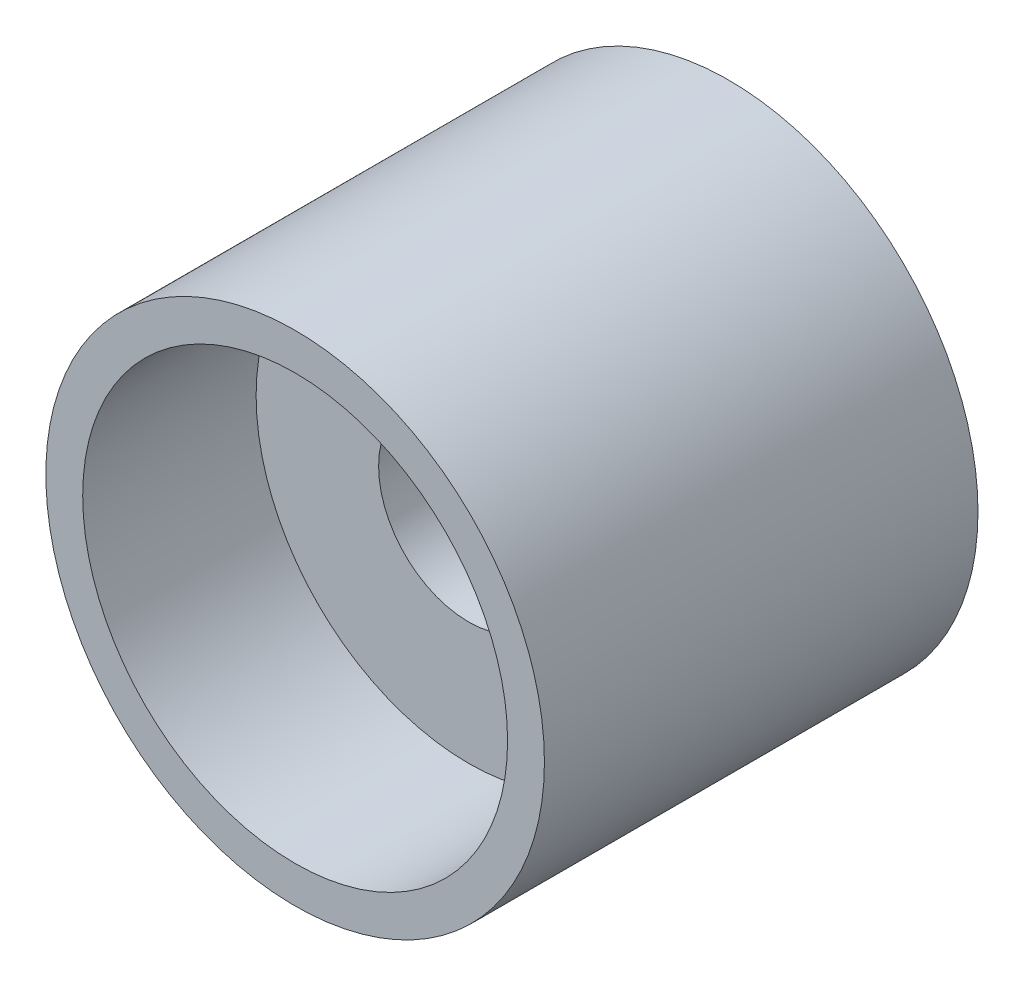
ISO-10303-21;
HEADER;
FILE_DESCRIPTION(('STEP AP214'),'2;1');
FILE_NAME('part.step','',(''),(''),'','','');
FILE_SCHEMA(('AUTOMOTIVE_DESIGN { 1 0 10303 214 1 1 1 1 }'));
ENDSEC;
DATA;
#1=APPLICATION_CONTEXT('core data for automotive mechanical design processes');
#2=APPLICATION_PROTOCOL_DEFINITION('international standard','automotive_design',2000,#1);
#3=PRODUCT_CONTEXT('',#1,'mechanical');
#4=PRODUCT('Part','Part','',(#3));
#5=PRODUCT_RELATED_PRODUCT_CATEGORY('part','',(#4));
#6=PRODUCT_DEFINITION_FORMATION('','',#4);
#7=PRODUCT_DEFINITION_CONTEXT('part definition',#1,'design');
#8=PRODUCT_DEFINITION('design','',#6,#7);
#9=PRODUCT_DEFINITION_SHAPE('','',#8);
#10=(LENGTH_UNIT() NAMED_UNIT(*) SI_UNIT(.MILLI.,.METRE.));
#11=(NAMED_UNIT(*) PLANE_ANGLE_UNIT() SI_UNIT($,.RADIAN.));
#12=(NAMED_UNIT(*) SI_UNIT($,.STERADIAN.) SOLID_ANGLE_UNIT());
#13=UNCERTAINTY_MEASURE_WITH_UNIT(LENGTH_MEASURE(1.E-05),#10,'distance_accuracy_value','');
#14=(GEOMETRIC_REPRESENTATION_CONTEXT(3) GLOBAL_UNCERTAINTY_ASSIGNED_CONTEXT((#13)) GLOBAL_UNIT_ASSIGNED_CONTEXT((#10,
#11,#12)) REPRESENTATION_CONTEXT('',''));
#15=CARTESIAN_POINT('',(0.,0.,0.));
#16=DIRECTION('',(0.,0.,1.));
#17=DIRECTION('',(1.,0.,0.));
#18=AXIS2_PLACEMENT_3D('',#15,#16,#17);
#19=CARTESIAN_POINT('',(0.,0.,20.));
#20=DIRECTION('',(0.,0.,-1.));
#21=DIRECTION('',(-1.,0.,0.));
#22=AXIS2_PLACEMENT_3D('',#19,#20,#21);
#23=CYLINDRICAL_SURFACE('',#22,4.15);
#24=CARTESIAN_POINT('',(0.,0.,0.));
#25=DIRECTION('',(0.,0.,1.));
#26=DIRECTION('',(1.,0.,0.));
#27=AXIS2_PLACEMENT_3D('',#24,#25,#26);
#28=CIRCLE('',#27,4.15);
#29=CARTESIAN_POINT('',(4.15,0.,0.));
#30=VERTEX_POINT('',#29);
#31=EDGE_CURVE('E44',#30,#30,#28,.T.);
#32=ORIENTED_EDGE('',*,*,#31,.F.);
#33=EDGE_LOOP('',(#32));
#34=FACE_BOUND('',#33,.T.);
#35=CARTESIAN_POINT('',(0.,0.,12.));
#36=DIRECTION('',(0.,0.,1.));
#37=DIRECTION('',(1.,0.,0.));
#38=AXIS2_PLACEMENT_3D('',#35,#36,#37);
#39=CIRCLE('',#38,4.15);
#40=CARTESIAN_POINT('',(4.15,0.,12.));
#41=VERTEX_POINT('',#40);
#42=EDGE_CURVE('E35',#41,#41,#39,.T.);
#43=ORIENTED_EDGE('',*,*,#42,.T.);
#44=EDGE_LOOP('',(#43));
#45=FACE_BOUND('',#44,.T.);
#46=ADVANCED_FACE('F31',(#34,#45),#23,.F.);
#47=CARTESIAN_POINT('',(0.,0.,20.));
#48=DIRECTION('',(0.,0.,1.));
#49=DIRECTION('',(1.,0.,0.));
#50=AXIS2_PLACEMENT_3D('',#47,#48,#49);
#51=PLANE('',#50);
#52=CARTESIAN_POINT('',(0.,0.,20.));
#53=DIRECTION('',(0.,0.,1.));
#54=DIRECTION('',(1.,0.,0.));
#55=AXIS2_PLACEMENT_3D('',#52,#53,#54);
#56=CIRCLE('',#55,9.8);
#57=CARTESIAN_POINT('',(9.8,0.,20.));
#58=VERTEX_POINT('',#57);
#59=EDGE_CURVE('E48',#58,#58,#56,.T.);
#60=ORIENTED_EDGE('',*,*,#59,.F.);
#61=EDGE_LOOP('',(#60));
#62=FACE_BOUND('',#61,.T.);
#63=CARTESIAN_POINT('',(0.,0.,20.));
#64=DIRECTION('',(0.,0.,1.));
#65=DIRECTION('',(1.,0.,0.));
#66=AXIS2_PLACEMENT_3D('',#63,#64,#65);
#67=CIRCLE('',#66,11.5);
#68=CARTESIAN_POINT('',(11.5,0.,20.));
#69=VERTEX_POINT('',#68);
#70=EDGE_CURVE('E10',#69,#69,#67,.T.);
#71=ORIENTED_EDGE('',*,*,#70,.T.);
#72=EDGE_LOOP('',(#71));
#73=FACE_BOUND('',#72,.T.);
#74=ADVANCED_FACE('F69',(#62,#73),#51,.T.);
#75=CARTESIAN_POINT('',(0.,0.,0.));
#76=DIRECTION('',(0.,0.,1.));
#77=DIRECTION('',(1.,0.,0.));
#78=AXIS2_PLACEMENT_3D('',#75,#76,#77);
#79=PLANE('',#78);
#80=CARTESIAN_POINT('',(0.,0.,0.));
#81=DIRECTION('',(0.,0.,1.));
#82=DIRECTION('',(1.,0.,0.));
#83=AXIS2_PLACEMENT_3D('',#80,#81,#82);
#84=CIRCLE('',#83,11.5);
#85=CARTESIAN_POINT('',(11.5,0.,0.));
#86=VERTEX_POINT('',#85);
#87=EDGE_CURVE('E39',#86,#86,#84,.T.);
#88=ORIENTED_EDGE('',*,*,#87,.F.);
#89=EDGE_LOOP('',(#88));
#90=FACE_BOUND('',#89,.T.);
#91=ORIENTED_EDGE('',*,*,#31,.T.);
#92=EDGE_LOOP('',(#91));
#93=FACE_BOUND('',#92,.T.);
#94=ADVANCED_FACE('F75',(#90,#93),#79,.F.);
#95=CARTESIAN_POINT('',(0.,0.,20.));
#96=DIRECTION('',(0.,0.,-1.));
#97=DIRECTION('',(-1.,0.,0.));
#98=AXIS2_PLACEMENT_3D('',#95,#96,#97);
#99=CYLINDRICAL_SURFACE('',#98,11.5);
#100=ORIENTED_EDGE('',*,*,#70,.F.);
#101=EDGE_LOOP('',(#100));
#102=FACE_BOUND('',#101,.T.);
#103=ORIENTED_EDGE('',*,*,#87,.T.);
#104=EDGE_LOOP('',(#103));
#105=FACE_BOUND('',#104,.T.);
#106=ADVANCED_FACE('F33',(#102,#105),#99,.T.);
#107=CARTESIAN_POINT('',(0.,0.,12.));
#108=DIRECTION('',(0.,0.,1.));
#109=DIRECTION('',(1.,0.,0.));
#110=AXIS2_PLACEMENT_3D('',#107,#108,#109);
#111=CYLINDRICAL_SURFACE('',#110,9.8);
#112=CARTESIAN_POINT('',(0.,0.,12.));
#113=DIRECTION('',(0.,0.,1.));
#114=DIRECTION('',(1.,0.,0.));
#115=AXIS2_PLACEMENT_3D('',#112,#113,#114);
#116=CIRCLE('',#115,9.8);
#117=CARTESIAN_POINT('',(9.8,0.,12.));
#118=VERTEX_POINT('',#117);
#119=EDGE_CURVE('E51',#118,#118,#116,.T.);
#120=ORIENTED_EDGE('',*,*,#119,.F.);
#121=EDGE_LOOP('',(#120));
#122=FACE_BOUND('',#121,.T.);
#123=ORIENTED_EDGE('',*,*,#59,.T.);
#124=EDGE_LOOP('',(#123));
#125=FACE_BOUND('',#124,.T.);
#126=ADVANCED_FACE('F61',(#122,#125),#111,.F.);
#127=CARTESIAN_POINT('',(0.,0.,12.));
#128=DIRECTION('',(0.,0.,1.));
#129=DIRECTION('',(1.,0.,0.));
#130=AXIS2_PLACEMENT_3D('',#127,#128,#129);
#131=PLANE('',#130);
#132=ORIENTED_EDGE('',*,*,#42,.F.);
#133=EDGE_LOOP('',(#132));
#134=FACE_BOUND('',#133,.T.);
#135=ORIENTED_EDGE('',*,*,#119,.T.);
#136=EDGE_LOOP('',(#135));
#137=FACE_BOUND('',#136,.T.);
#138=ADVANCED_FACE('F59',(#134,#137),#131,.T.);
#139=CLOSED_SHELL('',(#46,#74,#94,#106,#126,#138));
#140=MANIFOLD_SOLID_BREP('B2',#139);
#141=ADVANCED_BREP_SHAPE_REPRESENTATION('',(#18,#140),#14);
#142=SHAPE_DEFINITION_REPRESENTATION(#9,#141);
ENDSEC;
END-ISO-10303-21;
